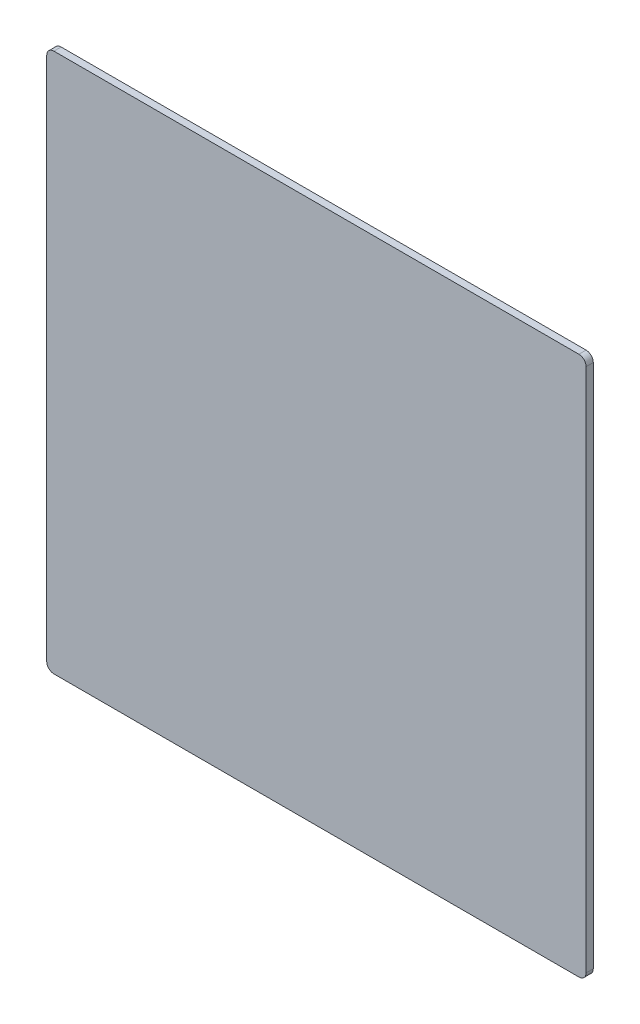
ISO-10303-21;
HEADER;
FILE_DESCRIPTION(('STEP AP214'),'2;1');
FILE_NAME('part.step','',(''),(''),'','','');
FILE_SCHEMA(('AUTOMOTIVE_DESIGN { 1 0 10303 214 1 1 1 1 }'));
ENDSEC;
DATA;
#1=APPLICATION_CONTEXT('core data for automotive mechanical design processes');
#2=APPLICATION_PROTOCOL_DEFINITION('international standard','automotive_design',2000,#1);
#3=PRODUCT_CONTEXT('',#1,'mechanical');
#4=PRODUCT('Part','Part','',(#3));
#5=PRODUCT_RELATED_PRODUCT_CATEGORY('part','',(#4));
#6=PRODUCT_DEFINITION_FORMATION('','',#4);
#7=PRODUCT_DEFINITION_CONTEXT('part definition',#1,'design');
#8=PRODUCT_DEFINITION('design','',#6,#7);
#9=PRODUCT_DEFINITION_SHAPE('','',#8);
#10=(LENGTH_UNIT() NAMED_UNIT(*) SI_UNIT(.MILLI.,.METRE.));
#11=(NAMED_UNIT(*) PLANE_ANGLE_UNIT() SI_UNIT($,.RADIAN.));
#12=(NAMED_UNIT(*) SI_UNIT($,.STERADIAN.) SOLID_ANGLE_UNIT());
#13=UNCERTAINTY_MEASURE_WITH_UNIT(LENGTH_MEASURE(1.E-05),#10,'distance_accuracy_value','');
#14=(GEOMETRIC_REPRESENTATION_CONTEXT(3) GLOBAL_UNCERTAINTY_ASSIGNED_CONTEXT((#13)) GLOBAL_UNIT_ASSIGNED_CONTEXT((#10,
#11,#12)) REPRESENTATION_CONTEXT('',''));
#15=CARTESIAN_POINT('',(0.,0.,0.));
#16=DIRECTION('',(0.,0.,1.));
#17=DIRECTION('',(1.,0.,0.));
#18=AXIS2_PLACEMENT_3D('',#15,#16,#17);
#19=CARTESIAN_POINT('',(-73.,-73.,2.));
#20=DIRECTION('',(0.,0.,-1.));
#21=DIRECTION('',(-1.,0.,0.));
#22=AXIS2_PLACEMENT_3D('',#19,#20,#21);
#23=CYLINDRICAL_SURFACE('',#22,1.99999999999999);
#24=CARTESIAN_POINT('',(-73.,-73.,0.));
#25=DIRECTION('',(0.,0.,1.));
#26=DIRECTION('',(1.,0.,0.));
#27=AXIS2_PLACEMENT_3D('',#24,#25,#26);
#28=CIRCLE('',#27,1.99999999999999);
#29=CARTESIAN_POINT('',(-75.,-73.,0.));
#30=VERTEX_POINT('',#29);
#31=CARTESIAN_POINT('',(-73.,-75.,0.));
#32=VERTEX_POINT('',#31);
#33=EDGE_CURVE('E131',#30,#32,#28,.T.);
#34=ORIENTED_EDGE('',*,*,#33,.T.);
#35=DIRECTION('',(0.,0.,-1.));
#36=VECTOR('',#35,1.);
#37=CARTESIAN_POINT('',(-73.,-75.,2.));
#38=LINE('',#37,#36);
#39=CARTESIAN_POINT('',(-73.,-75.,2.));
#40=VERTEX_POINT('',#39);
#41=EDGE_CURVE('E11',#40,#32,#38,.T.);
#42=ORIENTED_EDGE('',*,*,#41,.F.);
#43=CARTESIAN_POINT('',(-73.,-73.,2.));
#44=DIRECTION('',(0.,0.,1.));
#45=DIRECTION('',(1.,0.,0.));
#46=AXIS2_PLACEMENT_3D('',#43,#44,#45);
#47=CIRCLE('',#46,1.99999999999999);
#48=CARTESIAN_POINT('',(-75.,-73.,2.));
#49=VERTEX_POINT('',#48);
#50=EDGE_CURVE('E145',#49,#40,#47,.T.);
#51=ORIENTED_EDGE('',*,*,#50,.F.);
#52=DIRECTION('',(0.,0.,-1.));
#53=VECTOR('',#52,1.);
#54=CARTESIAN_POINT('',(-75.,-73.,2.));
#55=LINE('',#54,#53);
#56=EDGE_CURVE('E127',#49,#30,#55,.T.);
#57=ORIENTED_EDGE('',*,*,#56,.T.);
#58=EDGE_LOOP('',(#34,#42,#51,#57));
#59=FACE_BOUND('',#58,.T.);
#60=ADVANCED_FACE('F35',(#59),#23,.T.);
#61=CARTESIAN_POINT('',(-73.,-75.,2.));
#62=DIRECTION('',(0.,1.,0.));
#63=DIRECTION('',(0.,0.,1.));
#64=AXIS2_PLACEMENT_3D('',#61,#62,#63);
#65=PLANE('',#64);
#66=DIRECTION('',(1.,0.,0.));
#67=VECTOR('',#66,1.);
#68=CARTESIAN_POINT('',(-73.,-75.,0.));
#69=LINE('',#68,#67);
#70=CARTESIAN_POINT('',(73.,-75.,0.));
#71=VERTEX_POINT('',#70);
#72=EDGE_CURVE('E134',#32,#71,#69,.T.);
#73=ORIENTED_EDGE('',*,*,#72,.T.);
#74=DIRECTION('',(0.,0.,-1.));
#75=VECTOR('',#74,1.);
#76=CARTESIAN_POINT('',(73.,-75.,2.));
#77=LINE('',#76,#75);
#78=CARTESIAN_POINT('',(73.,-75.,2.));
#79=VERTEX_POINT('',#78);
#80=EDGE_CURVE('E43',#79,#71,#77,.T.);
#81=ORIENTED_EDGE('',*,*,#80,.F.);
#82=DIRECTION('',(1.,0.,0.));
#83=VECTOR('',#82,1.);
#84=CARTESIAN_POINT('',(-73.,-75.,2.));
#85=LINE('',#84,#83);
#86=EDGE_CURVE('E94',#40,#79,#85,.T.);
#87=ORIENTED_EDGE('',*,*,#86,.F.);
#88=ORIENTED_EDGE('',*,*,#41,.T.);
#89=EDGE_LOOP('',(#73,#81,#87,#88));
#90=FACE_BOUND('',#89,.T.);
#91=ADVANCED_FACE('F180',(#90),#65,.F.);
#92=CARTESIAN_POINT('',(73.,-73.,2.));
#93=DIRECTION('',(0.,0.,-1.));
#94=DIRECTION('',(-1.,0.,0.));
#95=AXIS2_PLACEMENT_3D('',#92,#93,#94);
#96=CYLINDRICAL_SURFACE('',#95,1.99999999999999);
#97=CARTESIAN_POINT('',(73.,-73.,0.));
#98=DIRECTION('',(0.,0.,1.));
#99=DIRECTION('',(1.,0.,0.));
#100=AXIS2_PLACEMENT_3D('',#97,#98,#99);
#101=CIRCLE('',#100,1.99999999999999);
#102=CARTESIAN_POINT('',(75.,-73.,0.));
#103=VERTEX_POINT('',#102);
#104=EDGE_CURVE('E136',#71,#103,#101,.T.);
#105=ORIENTED_EDGE('',*,*,#104,.T.);
#106=DIRECTION('',(0.,0.,-1.));
#107=VECTOR('',#106,1.);
#108=CARTESIAN_POINT('',(75.,-73.,2.));
#109=LINE('',#108,#107);
#110=CARTESIAN_POINT('',(75.,-73.,2.));
#111=VERTEX_POINT('',#110);
#112=EDGE_CURVE('E152',#111,#103,#109,.T.);
#113=ORIENTED_EDGE('',*,*,#112,.F.);
#114=CARTESIAN_POINT('',(73.,-73.,2.));
#115=DIRECTION('',(0.,0.,1.));
#116=DIRECTION('',(1.,0.,0.));
#117=AXIS2_PLACEMENT_3D('',#114,#115,#116);
#118=CIRCLE('',#117,1.99999999999999);
#119=EDGE_CURVE('E160',#79,#111,#118,.T.);
#120=ORIENTED_EDGE('',*,*,#119,.F.);
#121=ORIENTED_EDGE('',*,*,#80,.T.);
#122=EDGE_LOOP('',(#105,#113,#120,#121));
#123=FACE_BOUND('',#122,.T.);
#124=ADVANCED_FACE('F158',(#123),#96,.T.);
#125=CARTESIAN_POINT('',(75.,73.,2.));
#126=DIRECTION('',(-1.,0.,0.));
#127=DIRECTION('',(0.,0.,1.));
#128=AXIS2_PLACEMENT_3D('',#125,#126,#127);
#129=PLANE('',#128);
#130=DIRECTION('',(0.,1.,0.));
#131=VECTOR('',#130,1.);
#132=CARTESIAN_POINT('',(75.,73.,0.));
#133=LINE('',#132,#131);
#134=CARTESIAN_POINT('',(75.,73.,0.));
#135=VERTEX_POINT('',#134);
#136=EDGE_CURVE('E138',#103,#135,#133,.T.);
#137=ORIENTED_EDGE('',*,*,#136,.T.);
#138=DIRECTION('',(0.,0.,-1.));
#139=VECTOR('',#138,1.);
#140=CARTESIAN_POINT('',(75.,73.,2.));
#141=LINE('',#140,#139);
#142=CARTESIAN_POINT('',(75.,73.,2.));
#143=VERTEX_POINT('',#142);
#144=EDGE_CURVE('E149',#143,#135,#141,.T.);
#145=ORIENTED_EDGE('',*,*,#144,.F.);
#146=DIRECTION('',(0.,1.,0.));
#147=VECTOR('',#146,1.);
#148=CARTESIAN_POINT('',(75.,73.,2.));
#149=LINE('',#148,#147);
#150=EDGE_CURVE('E172',#111,#143,#149,.T.);
#151=ORIENTED_EDGE('',*,*,#150,.F.);
#152=ORIENTED_EDGE('',*,*,#112,.T.);
#153=EDGE_LOOP('',(#137,#145,#151,#152));
#154=FACE_BOUND('',#153,.T.);
#155=ADVANCED_FACE('F168',(#154),#129,.F.);
#156=CARTESIAN_POINT('',(73.,73.,2.));
#157=DIRECTION('',(0.,0.,-1.));
#158=DIRECTION('',(-1.,0.,0.));
#159=AXIS2_PLACEMENT_3D('',#156,#157,#158);
#160=CYLINDRICAL_SURFACE('',#159,2.);
#161=CARTESIAN_POINT('',(73.,73.,0.));
#162=DIRECTION('',(0.,0.,1.));
#163=DIRECTION('',(-1.,0.,0.));
#164=AXIS2_PLACEMENT_3D('',#161,#162,#163);
#165=CIRCLE('',#164,2.);
#166=CARTESIAN_POINT('',(73.,75.,0.));
#167=VERTEX_POINT('',#166);
#168=EDGE_CURVE('E140',#135,#167,#165,.T.);
#169=ORIENTED_EDGE('',*,*,#168,.T.);
#170=DIRECTION('',(0.,0.,-1.));
#171=VECTOR('',#170,1.);
#172=CARTESIAN_POINT('',(73.,75.,2.));
#173=LINE('',#172,#171);
#174=CARTESIAN_POINT('',(73.,75.,2.));
#175=VERTEX_POINT('',#174);
#176=EDGE_CURVE('E122',#175,#167,#173,.T.);
#177=ORIENTED_EDGE('',*,*,#176,.F.);
#178=CARTESIAN_POINT('',(73.,73.,2.));
#179=DIRECTION('',(0.,0.,1.));
#180=DIRECTION('',(-1.,0.,0.));
#181=AXIS2_PLACEMENT_3D('',#178,#179,#180);
#182=CIRCLE('',#181,2.);
#183=EDGE_CURVE('E113',#143,#175,#182,.T.);
#184=ORIENTED_EDGE('',*,*,#183,.F.);
#185=ORIENTED_EDGE('',*,*,#144,.T.);
#186=EDGE_LOOP('',(#169,#177,#184,#185));
#187=FACE_BOUND('',#186,.T.);
#188=ADVANCED_FACE('F171',(#187),#160,.T.);
#189=CARTESIAN_POINT('',(-73.,75.,2.));
#190=DIRECTION('',(0.,-1.,0.));
#191=DIRECTION('',(0.,0.,-1.));
#192=AXIS2_PLACEMENT_3D('',#189,#190,#191);
#193=PLANE('',#192);
#194=DIRECTION('',(-1.,0.,0.));
#195=VECTOR('',#194,1.);
#196=CARTESIAN_POINT('',(-73.,75.,0.));
#197=LINE('',#196,#195);
#198=CARTESIAN_POINT('',(-73.,75.,0.));
#199=VERTEX_POINT('',#198);
#200=EDGE_CURVE('E121',#167,#199,#197,.T.);
#201=ORIENTED_EDGE('',*,*,#200,.T.);
#202=DIRECTION('',(0.,0.,-1.));
#203=VECTOR('',#202,1.);
#204=CARTESIAN_POINT('',(-73.,75.,2.));
#205=LINE('',#204,#203);
#206=CARTESIAN_POINT('',(-73.,75.,2.));
#207=VERTEX_POINT('',#206);
#208=EDGE_CURVE('E118',#207,#199,#205,.T.);
#209=ORIENTED_EDGE('',*,*,#208,.F.);
#210=DIRECTION('',(-1.,0.,0.));
#211=VECTOR('',#210,1.);
#212=CARTESIAN_POINT('',(-73.,75.,2.));
#213=LINE('',#212,#211);
#214=EDGE_CURVE('E107',#175,#207,#213,.T.);
#215=ORIENTED_EDGE('',*,*,#214,.F.);
#216=ORIENTED_EDGE('',*,*,#176,.T.);
#217=EDGE_LOOP('',(#201,#209,#215,#216));
#218=FACE_BOUND('',#217,.T.);
#219=ADVANCED_FACE('F119',(#218),#193,.F.);
#220=CARTESIAN_POINT('',(-73.,73.,2.));
#221=DIRECTION('',(0.,0.,-1.));
#222=DIRECTION('',(-1.,0.,0.));
#223=AXIS2_PLACEMENT_3D('',#220,#221,#222);
#224=CYLINDRICAL_SURFACE('',#223,2.);
#225=CARTESIAN_POINT('',(-73.,73.,0.));
#226=DIRECTION('',(0.,0.,1.));
#227=DIRECTION('',(1.,0.,0.));
#228=AXIS2_PLACEMENT_3D('',#225,#226,#227);
#229=CIRCLE('',#228,2.);
#230=CARTESIAN_POINT('',(-75.,73.,0.));
#231=VERTEX_POINT('',#230);
#232=EDGE_CURVE('E80',#199,#231,#229,.T.);
#233=ORIENTED_EDGE('',*,*,#232,.T.);
#234=DIRECTION('',(0.,0.,-1.));
#235=VECTOR('',#234,1.);
#236=CARTESIAN_POINT('',(-75.,73.,2.));
#237=LINE('',#236,#235);
#238=CARTESIAN_POINT('',(-75.,73.,2.));
#239=VERTEX_POINT('',#238);
#240=EDGE_CURVE('E123',#239,#231,#237,.T.);
#241=ORIENTED_EDGE('',*,*,#240,.F.);
#242=CARTESIAN_POINT('',(-73.,73.,2.));
#243=DIRECTION('',(0.,0.,1.));
#244=DIRECTION('',(1.,0.,0.));
#245=AXIS2_PLACEMENT_3D('',#242,#243,#244);
#246=CIRCLE('',#245,2.);
#247=EDGE_CURVE('E111',#207,#239,#246,.T.);
#248=ORIENTED_EDGE('',*,*,#247,.F.);
#249=ORIENTED_EDGE('',*,*,#208,.T.);
#250=EDGE_LOOP('',(#233,#241,#248,#249));
#251=FACE_BOUND('',#250,.T.);
#252=ADVANCED_FACE('F125',(#251),#224,.T.);
#253=CARTESIAN_POINT('',(-75.,73.,2.));
#254=DIRECTION('',(1.,0.,0.));
#255=DIRECTION('',(0.,1.,0.));
#256=AXIS2_PLACEMENT_3D('',#253,#254,#255);
#257=PLANE('',#256);
#258=DIRECTION('',(0.,-1.,0.));
#259=VECTOR('',#258,1.);
#260=CARTESIAN_POINT('',(-75.,73.,0.));
#261=LINE('',#260,#259);
#262=EDGE_CURVE('E86',#231,#30,#261,.T.);
#263=ORIENTED_EDGE('',*,*,#262,.T.);
#264=ORIENTED_EDGE('',*,*,#56,.F.);
#265=DIRECTION('',(0.,-1.,0.));
#266=VECTOR('',#265,1.);
#267=CARTESIAN_POINT('',(-75.,73.,2.));
#268=LINE('',#267,#266);
#269=EDGE_CURVE('E51',#239,#49,#268,.T.);
#270=ORIENTED_EDGE('',*,*,#269,.F.);
#271=ORIENTED_EDGE('',*,*,#240,.T.);
#272=EDGE_LOOP('',(#263,#264,#270,#271));
#273=FACE_BOUND('',#272,.T.);
#274=ADVANCED_FACE('F196',(#273),#257,.F.);
#275=CARTESIAN_POINT('',(-73.,-73.,2.));
#276=DIRECTION('',(0.,0.,1.));
#277=DIRECTION('',(1.,0.,0.));
#278=AXIS2_PLACEMENT_3D('',#275,#276,#277);
#279=PLANE('',#278);
#280=ORIENTED_EDGE('',*,*,#50,.T.);
#281=ORIENTED_EDGE('',*,*,#86,.T.);
#282=ORIENTED_EDGE('',*,*,#119,.T.);
#283=ORIENTED_EDGE('',*,*,#150,.T.);
#284=ORIENTED_EDGE('',*,*,#183,.T.);
#285=ORIENTED_EDGE('',*,*,#214,.T.);
#286=ORIENTED_EDGE('',*,*,#247,.T.);
#287=ORIENTED_EDGE('',*,*,#269,.T.);
#288=EDGE_LOOP('',(#280,#281,#282,#283,#284,#285,#286,#287));
#289=FACE_BOUND('',#288,.T.);
#290=ADVANCED_FACE('F109',(#289),#279,.T.);
#291=CARTESIAN_POINT('',(-73.,-73.,0.));
#292=DIRECTION('',(0.,0.,1.));
#293=DIRECTION('',(1.,0.,0.));
#294=AXIS2_PLACEMENT_3D('',#291,#292,#293);
#295=PLANE('',#294);
#296=ORIENTED_EDGE('',*,*,#33,.F.);
#297=ORIENTED_EDGE('',*,*,#262,.F.);
#298=ORIENTED_EDGE('',*,*,#232,.F.);
#299=ORIENTED_EDGE('',*,*,#200,.F.);
#300=ORIENTED_EDGE('',*,*,#168,.F.);
#301=ORIENTED_EDGE('',*,*,#136,.F.);
#302=ORIENTED_EDGE('',*,*,#104,.F.);
#303=ORIENTED_EDGE('',*,*,#72,.F.);
#304=EDGE_LOOP('',(#296,#297,#298,#299,#300,#301,#302,#303));
#305=FACE_BOUND('',#304,.T.);
#306=ADVANCED_FACE('F164',(#305),#295,.F.);
#307=CLOSED_SHELL('',(#60,#91,#124,#155,#188,#219,#252,#274,#290,#306));
#308=MANIFOLD_SOLID_BREP('B2',#307);
#309=ADVANCED_BREP_SHAPE_REPRESENTATION('',(#18,#308),#14);
#310=SHAPE_DEFINITION_REPRESENTATION(#9,#309);
ENDSEC;
END-ISO-10303-21;
